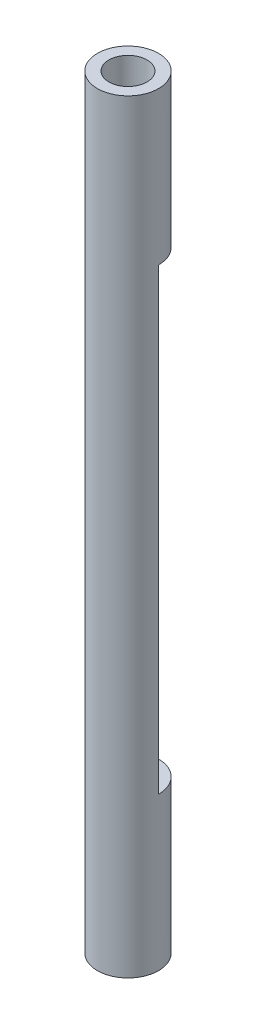
ISO-10303-21;
HEADER;
FILE_DESCRIPTION(('STEP AP214'),'2;1');
FILE_NAME('part.step','',(''),(''),'','','');
FILE_SCHEMA(('AUTOMOTIVE_DESIGN { 1 0 10303 214 1 1 1 1 }'));
ENDSEC;
DATA;
#1=APPLICATION_CONTEXT('core data for automotive mechanical design processes');
#2=APPLICATION_PROTOCOL_DEFINITION('international standard','automotive_design',2000,#1);
#3=PRODUCT_CONTEXT('',#1,'mechanical');
#4=PRODUCT('Part','Part','',(#3));
#5=PRODUCT_RELATED_PRODUCT_CATEGORY('part','',(#4));
#6=PRODUCT_DEFINITION_FORMATION('','',#4);
#7=PRODUCT_DEFINITION_CONTEXT('part definition',#1,'design');
#8=PRODUCT_DEFINITION('design','',#6,#7);
#9=PRODUCT_DEFINITION_SHAPE('','',#8);
#10=(LENGTH_UNIT() NAMED_UNIT(*) SI_UNIT(.MILLI.,.METRE.));
#11=(NAMED_UNIT(*) PLANE_ANGLE_UNIT() SI_UNIT($,.RADIAN.));
#12=(NAMED_UNIT(*) SI_UNIT($,.STERADIAN.) SOLID_ANGLE_UNIT());
#13=UNCERTAINTY_MEASURE_WITH_UNIT(LENGTH_MEASURE(1.E-05),#10,'distance_accuracy_value','');
#14=(GEOMETRIC_REPRESENTATION_CONTEXT(3) GLOBAL_UNCERTAINTY_ASSIGNED_CONTEXT((#13)) GLOBAL_UNIT_ASSIGNED_CONTEXT((#10,
#11,#12)) REPRESENTATION_CONTEXT('',''));
#15=CARTESIAN_POINT('',(0.,0.,0.));
#16=DIRECTION('',(0.,0.,1.));
#17=DIRECTION('',(1.,0.,0.));
#18=AXIS2_PLACEMENT_3D('',#15,#16,#17);
#19=CARTESIAN_POINT('',(0.,100.,0.));
#20=DIRECTION('',(0.,1.,0.));
#21=DIRECTION('',(0.,0.,1.));
#22=AXIS2_PLACEMENT_3D('',#19,#20,#21);
#23=PLANE('',#22);
#24=CARTESIAN_POINT('',(0.,100.,0.));
#25=DIRECTION('',(0.,1.,0.));
#26=DIRECTION('',(0.,0.,1.));
#27=AXIS2_PLACEMENT_3D('',#24,#25,#26);
#28=CIRCLE('',#27,4.);
#29=CARTESIAN_POINT('',(0.,100.,4.));
#30=VERTEX_POINT('',#29);
#31=EDGE_CURVE('E124',#30,#30,#28,.T.);
#32=ORIENTED_EDGE('',*,*,#31,.T.);
#33=EDGE_LOOP('',(#32));
#34=FACE_BOUND('',#33,.T.);
#35=CARTESIAN_POINT('',(0.,100.,0.));
#36=DIRECTION('',(0.,1.,0.));
#37=DIRECTION('',(0.,0.,1.));
#38=AXIS2_PLACEMENT_3D('',#35,#36,#37);
#39=CIRCLE('',#38,2.5);
#40=CARTESIAN_POINT('',(0.,100.,2.5));
#41=VERTEX_POINT('',#40);
#42=EDGE_CURVE('E116',#41,#41,#39,.T.);
#43=ORIENTED_EDGE('',*,*,#42,.F.);
#44=EDGE_LOOP('',(#43));
#45=FACE_BOUND('',#44,.T.);
#46=ADVANCED_FACE('F45',(#34,#45),#23,.T.);
#47=CARTESIAN_POINT('',(0.,0.,0.));
#48=DIRECTION('',(0.,1.,0.));
#49=DIRECTION('',(0.,0.,1.));
#50=AXIS2_PLACEMENT_3D('',#47,#48,#49);
#51=PLANE('',#50);
#52=CARTESIAN_POINT('',(0.,0.,0.));
#53=DIRECTION('',(0.,1.,0.));
#54=DIRECTION('',(0.,0.,1.));
#55=AXIS2_PLACEMENT_3D('',#52,#53,#54);
#56=CIRCLE('',#55,4.);
#57=CARTESIAN_POINT('',(0.,0.,4.));
#58=VERTEX_POINT('',#57);
#59=EDGE_CURVE('E120',#58,#58,#56,.T.);
#60=ORIENTED_EDGE('',*,*,#59,.F.);
#61=EDGE_LOOP('',(#60));
#62=FACE_BOUND('',#61,.T.);
#63=CARTESIAN_POINT('',(0.,0.,0.));
#64=DIRECTION('',(0.,1.,0.));
#65=DIRECTION('',(0.,0.,1.));
#66=AXIS2_PLACEMENT_3D('',#63,#64,#65);
#67=CIRCLE('',#66,2.5);
#68=CARTESIAN_POINT('',(0.,0.,2.5));
#69=VERTEX_POINT('',#68);
#70=EDGE_CURVE('E111',#69,#69,#67,.T.);
#71=ORIENTED_EDGE('',*,*,#70,.T.);
#72=EDGE_LOOP('',(#71));
#73=FACE_BOUND('',#72,.T.);
#74=ADVANCED_FACE('F158',(#62,#73),#51,.F.);
#75=CARTESIAN_POINT('',(0.,100.,0.));
#76=DIRECTION('',(0.,-1.,0.));
#77=DIRECTION('',(0.,0.,-1.));
#78=AXIS2_PLACEMENT_3D('',#75,#76,#77);
#79=CYLINDRICAL_SURFACE('',#78,4.);
#80=CARTESIAN_POINT('',(0.,80.,0.));
#81=DIRECTION('',(0.,1.,0.));
#82=DIRECTION('',(0.,0.,1.));
#83=AXIS2_PLACEMENT_3D('',#80,#81,#82);
#84=CIRCLE('',#83,4.);
#85=CARTESIAN_POINT('',(4.,80.,0.));
#86=VERTEX_POINT('',#85);
#87=CARTESIAN_POINT('',(-4.,80.,0.));
#88=VERTEX_POINT('',#87);
#89=EDGE_CURVE('E106',#86,#88,#84,.T.);
#90=ORIENTED_EDGE('',*,*,#89,.T.);
#91=DIRECTION('',(0.,-1.,0.));
#92=VECTOR('',#91,1.);
#93=CARTESIAN_POINT('',(-4.,20.,0.));
#94=LINE('',#93,#92);
#95=CARTESIAN_POINT('',(-4.,20.,0.));
#96=VERTEX_POINT('',#95);
#97=EDGE_CURVE('E93',#88,#96,#94,.T.);
#98=ORIENTED_EDGE('',*,*,#97,.T.);
#99=CARTESIAN_POINT('',(0.,20.,0.));
#100=DIRECTION('',(0.,-1.,0.));
#101=DIRECTION('',(0.,0.,-1.));
#102=AXIS2_PLACEMENT_3D('',#99,#100,#101);
#103=CIRCLE('',#102,4.);
#104=CARTESIAN_POINT('',(4.,20.,0.));
#105=VERTEX_POINT('',#104);
#106=EDGE_CURVE('E88',#96,#105,#103,.T.);
#107=ORIENTED_EDGE('',*,*,#106,.T.);
#108=DIRECTION('',(0.,-1.,0.));
#109=VECTOR('',#108,1.);
#110=CARTESIAN_POINT('',(4.,20.,0.));
#111=LINE('',#110,#109);
#112=EDGE_CURVE('E96',#86,#105,#111,.T.);
#113=ORIENTED_EDGE('',*,*,#112,.F.);
#114=EDGE_LOOP('',(#90,#98,#107,#113));
#115=FACE_BOUND('',#114,.T.);
#116=ORIENTED_EDGE('',*,*,#31,.F.);
#117=EDGE_LOOP('',(#116));
#118=FACE_BOUND('',#117,.T.);
#119=ORIENTED_EDGE('',*,*,#59,.T.);
#120=EDGE_LOOP('',(#119));
#121=FACE_BOUND('',#120,.T.);
#122=ADVANCED_FACE('F47',(#115,#118,#121),#79,.T.);
#123=CARTESIAN_POINT('',(0.,100.,0.));
#124=DIRECTION('',(0.,-1.,0.));
#125=DIRECTION('',(0.,0.,-1.));
#126=AXIS2_PLACEMENT_3D('',#123,#124,#125);
#127=CYLINDRICAL_SURFACE('',#126,2.5);
#128=CARTESIAN_POINT('',(0.,80.,0.));
#129=DIRECTION('',(0.,1.,0.));
#130=DIRECTION('',(0.,0.,1.));
#131=AXIS2_PLACEMENT_3D('',#128,#129,#130);
#132=CIRCLE('',#131,2.5);
#133=CARTESIAN_POINT('',(2.5,80.,0.));
#134=VERTEX_POINT('',#133);
#135=CARTESIAN_POINT('',(-2.5,80.,0.));
#136=VERTEX_POINT('',#135);
#137=EDGE_CURVE('E11',#134,#136,#132,.T.);
#138=ORIENTED_EDGE('',*,*,#137,.F.);
#139=DIRECTION('',(0.,-1.,0.));
#140=VECTOR('',#139,1.);
#141=CARTESIAN_POINT('',(2.5,100.,0.));
#142=LINE('',#141,#140);
#143=CARTESIAN_POINT('',(2.5,20.,0.));
#144=VERTEX_POINT('',#143);
#145=EDGE_CURVE('E133',#144,#134,#142,.F.);
#146=ORIENTED_EDGE('',*,*,#145,.F.);
#147=CARTESIAN_POINT('',(0.,20.,0.));
#148=DIRECTION('',(0.,-1.,0.));
#149=DIRECTION('',(0.,0.,-1.));
#150=AXIS2_PLACEMENT_3D('',#147,#148,#149);
#151=CIRCLE('',#150,2.5);
#152=CARTESIAN_POINT('',(-2.5,20.,0.));
#153=VERTEX_POINT('',#152);
#154=EDGE_CURVE('E90',#153,#144,#151,.T.);
#155=ORIENTED_EDGE('',*,*,#154,.F.);
#156=DIRECTION('',(0.,-1.,0.));
#157=VECTOR('',#156,1.);
#158=CARTESIAN_POINT('',(-2.5,100.,0.));
#159=LINE('',#158,#157);
#160=EDGE_CURVE('E54',#136,#153,#159,.T.);
#161=ORIENTED_EDGE('',*,*,#160,.F.);
#162=EDGE_LOOP('',(#138,#146,#155,#161));
#163=FACE_BOUND('',#162,.T.);
#164=ORIENTED_EDGE('',*,*,#42,.T.);
#165=EDGE_LOOP('',(#164));
#166=FACE_BOUND('',#165,.T.);
#167=ORIENTED_EDGE('',*,*,#70,.F.);
#168=EDGE_LOOP('',(#167));
#169=FACE_BOUND('',#168,.T.);
#170=ADVANCED_FACE('F141',(#163,#166,#169),#127,.F.);
#171=CARTESIAN_POINT('',(-4.,20.,0.));
#172=DIRECTION('',(0.,0.,1.));
#173=DIRECTION('',(0.,-1.,0.));
#174=AXIS2_PLACEMENT_3D('',#171,#172,#173);
#175=PLANE('',#174);
#176=ORIENTED_EDGE('',*,*,#160,.T.);
#177=DIRECTION('',(1.,0.,0.));
#178=VECTOR('',#177,1.);
#179=CARTESIAN_POINT('',(-4.,20.,0.));
#180=LINE('',#179,#178);
#181=EDGE_CURVE('E69',#96,#153,#180,.T.);
#182=ORIENTED_EDGE('',*,*,#181,.F.);
#183=ORIENTED_EDGE('',*,*,#97,.F.);
#184=DIRECTION('',(1.,0.,0.));
#185=VECTOR('',#184,1.);
#186=CARTESIAN_POINT('',(-4.,80.,0.));
#187=LINE('',#186,#185);
#188=EDGE_CURVE('E107',#88,#136,#187,.T.);
#189=ORIENTED_EDGE('',*,*,#188,.T.);
#190=EDGE_LOOP('',(#176,#182,#183,#189));
#191=FACE_BOUND('',#190,.T.);
#192=ADVANCED_FACE('F138',(#191),#175,.F.);
#193=CARTESIAN_POINT('',(-4.,80.,-8.));
#194=DIRECTION('',(0.,1.,0.));
#195=DIRECTION('',(0.,0.,1.));
#196=AXIS2_PLACEMENT_3D('',#193,#194,#195);
#197=PLANE('',#196);
#198=EDGE_CURVE('E61',#134,#86,#187,.T.);
#199=ORIENTED_EDGE('',*,*,#198,.F.);
#200=ORIENTED_EDGE('',*,*,#137,.T.);
#201=ORIENTED_EDGE('',*,*,#188,.F.);
#202=ORIENTED_EDGE('',*,*,#89,.F.);
#203=EDGE_LOOP('',(#199,#200,#201,#202));
#204=FACE_BOUND('',#203,.T.);
#205=ADVANCED_FACE('F144',(#204),#197,.F.);
#206=CARTESIAN_POINT('',(-4.,20.,-8.));
#207=DIRECTION('',(0.,-1.,0.));
#208=DIRECTION('',(0.,0.,-1.));
#209=AXIS2_PLACEMENT_3D('',#206,#207,#208);
#210=PLANE('',#209);
#211=ORIENTED_EDGE('',*,*,#181,.T.);
#212=ORIENTED_EDGE('',*,*,#154,.T.);
#213=EDGE_CURVE('E85',#144,#105,#180,.T.);
#214=ORIENTED_EDGE('',*,*,#213,.T.);
#215=ORIENTED_EDGE('',*,*,#106,.F.);
#216=EDGE_LOOP('',(#211,#212,#214,#215));
#217=FACE_BOUND('',#216,.T.);
#218=ADVANCED_FACE('F86',(#217),#210,.F.);
#219=ORIENTED_EDGE('',*,*,#145,.T.);
#220=ORIENTED_EDGE('',*,*,#198,.T.);
#221=ORIENTED_EDGE('',*,*,#112,.T.);
#222=ORIENTED_EDGE('',*,*,#213,.F.);
#223=EDGE_LOOP('',(#219,#220,#221,#222));
#224=FACE_BOUND('',#223,.T.);
#225=ADVANCED_FACE('F97',(#224),#175,.F.);
#226=CLOSED_SHELL('',(#46,#74,#122,#170,#192,#205,#218,#225));
#227=MANIFOLD_SOLID_BREP('B2',#226);
#228=ADVANCED_BREP_SHAPE_REPRESENTATION('',(#18,#227),#14);
#229=SHAPE_DEFINITION_REPRESENTATION(#9,#228);
ENDSEC;
END-ISO-10303-21;
